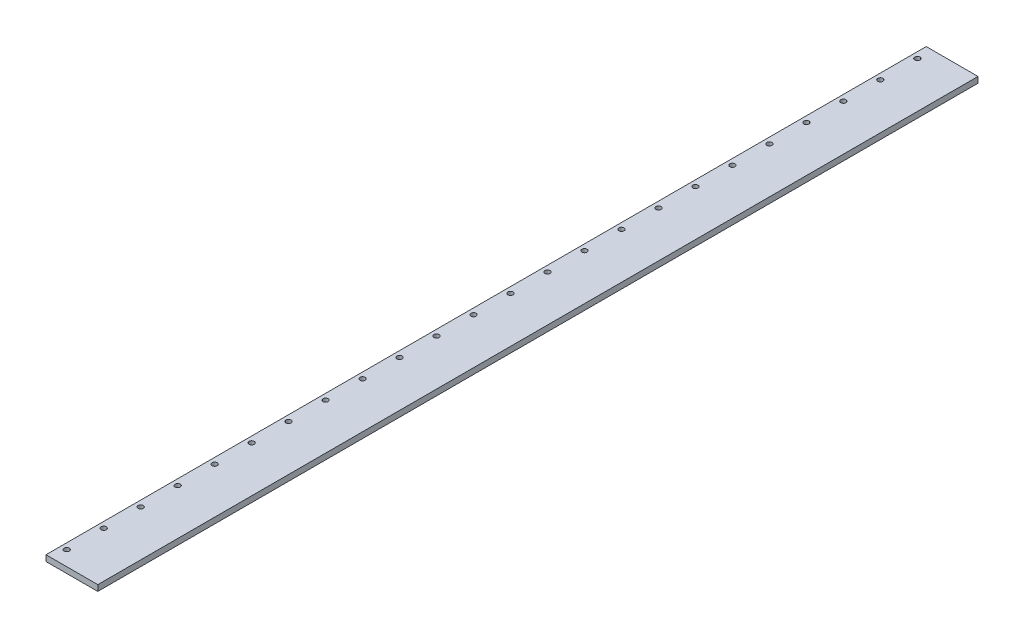
ISO-10303-21;
HEADER;
FILE_DESCRIPTION(('STEP AP214'),'2;1');
FILE_NAME('part.step','',(''),(''),'','','');
FILE_SCHEMA(('AUTOMOTIVE_DESIGN { 1 0 10303 214 1 1 1 1 }'));
ENDSEC;
DATA;
#1=APPLICATION_CONTEXT('core data for automotive mechanical design processes');
#2=APPLICATION_PROTOCOL_DEFINITION('international standard','automotive_design',2000,#1);
#3=PRODUCT_CONTEXT('',#1,'mechanical');
#4=PRODUCT('Part','Part','',(#3));
#5=PRODUCT_RELATED_PRODUCT_CATEGORY('part','',(#4));
#6=PRODUCT_DEFINITION_FORMATION('','',#4);
#7=PRODUCT_DEFINITION_CONTEXT('part definition',#1,'design');
#8=PRODUCT_DEFINITION('design','',#6,#7);
#9=PRODUCT_DEFINITION_SHAPE('','',#8);
#10=(LENGTH_UNIT() NAMED_UNIT(*) SI_UNIT(.MILLI.,.METRE.));
#11=(NAMED_UNIT(*) PLANE_ANGLE_UNIT() SI_UNIT($,.RADIAN.));
#12=(NAMED_UNIT(*) SI_UNIT($,.STERADIAN.) SOLID_ANGLE_UNIT());
#13=UNCERTAINTY_MEASURE_WITH_UNIT(LENGTH_MEASURE(1.E-05),#10,'distance_accuracy_value','');
#14=(GEOMETRIC_REPRESENTATION_CONTEXT(3) GLOBAL_UNCERTAINTY_ASSIGNED_CONTEXT((#13)) GLOBAL_UNIT_ASSIGNED_CONTEXT((#10,
#11,#12)) REPRESENTATION_CONTEXT('',''));
#15=CARTESIAN_POINT('',(0.,0.,0.));
#16=DIRECTION('',(0.,0.,1.));
#17=DIRECTION('',(1.,0.,0.));
#18=AXIS2_PLACEMENT_3D('',#15,#16,#17);
#19=CARTESIAN_POINT('',(-13.5,-2.,585.));
#20=DIRECTION('',(0.,1.,0.));
#21=DIRECTION('',(-1.,0.,0.));
#22=AXIS2_PLACEMENT_3D('',#19,#20,#21);
#23=CYLINDRICAL_SURFACE('',#22,1.75);
#24=CARTESIAN_POINT('',(-13.5,-2.,585.));
#25=DIRECTION('',(0.,1.,0.));
#26=DIRECTION('',(-1.,0.,0.));
#27=AXIS2_PLACEMENT_3D('',#24,#25,#26);
#28=CIRCLE('',#27,1.75);
#29=CARTESIAN_POINT('',(-15.25,-2.,585.));
#30=VERTEX_POINT('',#29);
#31=EDGE_CURVE('E46',#30,#30,#28,.T.);
#32=ORIENTED_EDGE('',*,*,#31,.F.);
#33=EDGE_LOOP('',(#32));
#34=FACE_BOUND('',#33,.T.);
#35=CARTESIAN_POINT('',(-13.5,2.,585.));
#36=DIRECTION('',(0.,1.,0.));
#37=DIRECTION('',(-1.,0.,0.));
#38=AXIS2_PLACEMENT_3D('',#35,#36,#37);
#39=CIRCLE('',#38,1.75);
#40=CARTESIAN_POINT('',(-15.25,2.,585.));
#41=VERTEX_POINT('',#40);
#42=EDGE_CURVE('E11',#41,#41,#39,.T.);
#43=ORIENTED_EDGE('',*,*,#42,.T.);
#44=EDGE_LOOP('',(#43));
#45=FACE_BOUND('',#44,.T.);
#46=ADVANCED_FACE('F37',(#34,#45),#23,.F.);
#47=CARTESIAN_POINT('',(-13.5,-2.,560.));
#48=DIRECTION('',(0.,1.,0.));
#49=DIRECTION('',(-1.,0.,0.));
#50=AXIS2_PLACEMENT_3D('',#47,#48,#49);
#51=CYLINDRICAL_SURFACE('',#50,1.75);
#52=CARTESIAN_POINT('',(-13.5,-2.,560.));
#53=DIRECTION('',(0.,1.,0.));
#54=DIRECTION('',(-1.,0.,0.));
#55=AXIS2_PLACEMENT_3D('',#52,#53,#54);
#56=CIRCLE('',#55,1.75);
#57=CARTESIAN_POINT('',(-15.25,-2.,560.));
#58=VERTEX_POINT('',#57);
#59=EDGE_CURVE('E287',#58,#58,#56,.T.);
#60=ORIENTED_EDGE('',*,*,#59,.F.);
#61=EDGE_LOOP('',(#60));
#62=FACE_BOUND('',#61,.T.);
#63=CARTESIAN_POINT('',(-13.5,2.,560.));
#64=DIRECTION('',(0.,1.,0.));
#65=DIRECTION('',(-1.,0.,0.));
#66=AXIS2_PLACEMENT_3D('',#63,#64,#65);
#67=CIRCLE('',#66,1.75);
#68=CARTESIAN_POINT('',(-15.25,2.,560.));
#69=VERTEX_POINT('',#68);
#70=EDGE_CURVE('E291',#69,#69,#67,.T.);
#71=ORIENTED_EDGE('',*,*,#70,.T.);
#72=EDGE_LOOP('',(#71));
#73=FACE_BOUND('',#72,.T.);
#74=ADVANCED_FACE('F302',(#62,#73),#51,.F.);
#75=CARTESIAN_POINT('',(-13.5,-2.,535.));
#76=DIRECTION('',(0.,1.,0.));
#77=DIRECTION('',(-1.,0.,0.));
#78=AXIS2_PLACEMENT_3D('',#75,#76,#77);
#79=CYLINDRICAL_SURFACE('',#78,1.75);
#80=CARTESIAN_POINT('',(-13.5,-2.,535.));
#81=DIRECTION('',(0.,1.,0.));
#82=DIRECTION('',(-1.,0.,0.));
#83=AXIS2_PLACEMENT_3D('',#80,#81,#82);
#84=CIRCLE('',#83,1.75);
#85=CARTESIAN_POINT('',(-15.25,-2.,535.));
#86=VERTEX_POINT('',#85);
#87=EDGE_CURVE('E279',#86,#86,#84,.T.);
#88=ORIENTED_EDGE('',*,*,#87,.F.);
#89=EDGE_LOOP('',(#88));
#90=FACE_BOUND('',#89,.T.);
#91=CARTESIAN_POINT('',(-13.5,2.,535.));
#92=DIRECTION('',(0.,1.,0.));
#93=DIRECTION('',(-1.,0.,0.));
#94=AXIS2_PLACEMENT_3D('',#91,#92,#93);
#95=CIRCLE('',#94,1.75);
#96=CARTESIAN_POINT('',(-15.25,2.,535.));
#97=VERTEX_POINT('',#96);
#98=EDGE_CURVE('E283',#97,#97,#95,.T.);
#99=ORIENTED_EDGE('',*,*,#98,.T.);
#100=EDGE_LOOP('',(#99));
#101=FACE_BOUND('',#100,.T.);
#102=ADVANCED_FACE('F395',(#90,#101),#79,.F.);
#103=CARTESIAN_POINT('',(-13.5,-2.,510.));
#104=DIRECTION('',(0.,1.,0.));
#105=DIRECTION('',(-1.,0.,0.));
#106=AXIS2_PLACEMENT_3D('',#103,#104,#105);
#107=CYLINDRICAL_SURFACE('',#106,1.75);
#108=CARTESIAN_POINT('',(-13.5,-2.,510.));
#109=DIRECTION('',(0.,1.,0.));
#110=DIRECTION('',(-1.,0.,0.));
#111=AXIS2_PLACEMENT_3D('',#108,#109,#110);
#112=CIRCLE('',#111,1.75);
#113=CARTESIAN_POINT('',(-15.25,-2.,510.));
#114=VERTEX_POINT('',#113);
#115=EDGE_CURVE('E271',#114,#114,#112,.T.);
#116=ORIENTED_EDGE('',*,*,#115,.F.);
#117=EDGE_LOOP('',(#116));
#118=FACE_BOUND('',#117,.T.);
#119=CARTESIAN_POINT('',(-13.5,2.,510.));
#120=DIRECTION('',(0.,1.,0.));
#121=DIRECTION('',(-1.,0.,0.));
#122=AXIS2_PLACEMENT_3D('',#119,#120,#121);
#123=CIRCLE('',#122,1.75);
#124=CARTESIAN_POINT('',(-15.25,2.,510.));
#125=VERTEX_POINT('',#124);
#126=EDGE_CURVE('E275',#125,#125,#123,.T.);
#127=ORIENTED_EDGE('',*,*,#126,.T.);
#128=EDGE_LOOP('',(#127));
#129=FACE_BOUND('',#128,.T.);
#130=ADVANCED_FACE('F391',(#118,#129),#107,.F.);
#131=CARTESIAN_POINT('',(-13.5,-2.,485.));
#132=DIRECTION('',(0.,1.,0.));
#133=DIRECTION('',(-1.,0.,0.));
#134=AXIS2_PLACEMENT_3D('',#131,#132,#133);
#135=CYLINDRICAL_SURFACE('',#134,1.75);
#136=CARTESIAN_POINT('',(-13.5,-2.,485.));
#137=DIRECTION('',(0.,1.,0.));
#138=DIRECTION('',(-1.,0.,0.));
#139=AXIS2_PLACEMENT_3D('',#136,#137,#138);
#140=CIRCLE('',#139,1.75);
#141=CARTESIAN_POINT('',(-15.25,-2.,485.));
#142=VERTEX_POINT('',#141);
#143=EDGE_CURVE('E263',#142,#142,#140,.T.);
#144=ORIENTED_EDGE('',*,*,#143,.F.);
#145=EDGE_LOOP('',(#144));
#146=FACE_BOUND('',#145,.T.);
#147=CARTESIAN_POINT('',(-13.5,2.,485.));
#148=DIRECTION('',(0.,1.,0.));
#149=DIRECTION('',(-1.,0.,0.));
#150=AXIS2_PLACEMENT_3D('',#147,#148,#149);
#151=CIRCLE('',#150,1.75);
#152=CARTESIAN_POINT('',(-15.25,2.,485.));
#153=VERTEX_POINT('',#152);
#154=EDGE_CURVE('E267',#153,#153,#151,.T.);
#155=ORIENTED_EDGE('',*,*,#154,.T.);
#156=EDGE_LOOP('',(#155));
#157=FACE_BOUND('',#156,.T.);
#158=ADVANCED_FACE('F387',(#146,#157),#135,.F.);
#159=CARTESIAN_POINT('',(-13.5,-2.,460.));
#160=DIRECTION('',(0.,1.,0.));
#161=DIRECTION('',(-1.,0.,0.));
#162=AXIS2_PLACEMENT_3D('',#159,#160,#161);
#163=CYLINDRICAL_SURFACE('',#162,1.75);
#164=CARTESIAN_POINT('',(-13.5,-2.,460.));
#165=DIRECTION('',(0.,1.,0.));
#166=DIRECTION('',(-1.,0.,0.));
#167=AXIS2_PLACEMENT_3D('',#164,#165,#166);
#168=CIRCLE('',#167,1.75);
#169=CARTESIAN_POINT('',(-15.25,-2.,460.));
#170=VERTEX_POINT('',#169);
#171=EDGE_CURVE('E255',#170,#170,#168,.T.);
#172=ORIENTED_EDGE('',*,*,#171,.F.);
#173=EDGE_LOOP('',(#172));
#174=FACE_BOUND('',#173,.T.);
#175=CARTESIAN_POINT('',(-13.5,2.,460.));
#176=DIRECTION('',(0.,1.,0.));
#177=DIRECTION('',(-1.,0.,0.));
#178=AXIS2_PLACEMENT_3D('',#175,#176,#177);
#179=CIRCLE('',#178,1.75);
#180=CARTESIAN_POINT('',(-15.25,2.,460.));
#181=VERTEX_POINT('',#180);
#182=EDGE_CURVE('E259',#181,#181,#179,.T.);
#183=ORIENTED_EDGE('',*,*,#182,.T.);
#184=EDGE_LOOP('',(#183));
#185=FACE_BOUND('',#184,.T.);
#186=ADVANCED_FACE('F383',(#174,#185),#163,.F.);
#187=CARTESIAN_POINT('',(-13.5,-2.,435.));
#188=DIRECTION('',(0.,1.,0.));
#189=DIRECTION('',(-1.,0.,0.));
#190=AXIS2_PLACEMENT_3D('',#187,#188,#189);
#191=CYLINDRICAL_SURFACE('',#190,1.75);
#192=CARTESIAN_POINT('',(-13.5,-2.,435.));
#193=DIRECTION('',(0.,1.,0.));
#194=DIRECTION('',(-1.,0.,0.));
#195=AXIS2_PLACEMENT_3D('',#192,#193,#194);
#196=CIRCLE('',#195,1.75);
#197=CARTESIAN_POINT('',(-15.25,-2.,435.));
#198=VERTEX_POINT('',#197);
#199=EDGE_CURVE('E247',#198,#198,#196,.T.);
#200=ORIENTED_EDGE('',*,*,#199,.F.);
#201=EDGE_LOOP('',(#200));
#202=FACE_BOUND('',#201,.T.);
#203=CARTESIAN_POINT('',(-13.5,2.,435.));
#204=DIRECTION('',(0.,1.,0.));
#205=DIRECTION('',(-1.,0.,0.));
#206=AXIS2_PLACEMENT_3D('',#203,#204,#205);
#207=CIRCLE('',#206,1.75);
#208=CARTESIAN_POINT('',(-15.25,2.,435.));
#209=VERTEX_POINT('',#208);
#210=EDGE_CURVE('E251',#209,#209,#207,.T.);
#211=ORIENTED_EDGE('',*,*,#210,.T.);
#212=EDGE_LOOP('',(#211));
#213=FACE_BOUND('',#212,.T.);
#214=ADVANCED_FACE('F379',(#202,#213),#191,.F.);
#215=CARTESIAN_POINT('',(-13.5,-2.,410.));
#216=DIRECTION('',(0.,1.,0.));
#217=DIRECTION('',(-1.,0.,0.));
#218=AXIS2_PLACEMENT_3D('',#215,#216,#217);
#219=CYLINDRICAL_SURFACE('',#218,1.75);
#220=CARTESIAN_POINT('',(-13.5,-2.,410.));
#221=DIRECTION('',(0.,1.,0.));
#222=DIRECTION('',(-1.,0.,0.));
#223=AXIS2_PLACEMENT_3D('',#220,#221,#222);
#224=CIRCLE('',#223,1.75);
#225=CARTESIAN_POINT('',(-15.25,-2.,410.));
#226=VERTEX_POINT('',#225);
#227=EDGE_CURVE('E239',#226,#226,#224,.T.);
#228=ORIENTED_EDGE('',*,*,#227,.F.);
#229=EDGE_LOOP('',(#228));
#230=FACE_BOUND('',#229,.T.);
#231=CARTESIAN_POINT('',(-13.5,2.,410.));
#232=DIRECTION('',(0.,1.,0.));
#233=DIRECTION('',(-1.,0.,0.));
#234=AXIS2_PLACEMENT_3D('',#231,#232,#233);
#235=CIRCLE('',#234,1.75);
#236=CARTESIAN_POINT('',(-15.25,2.,410.));
#237=VERTEX_POINT('',#236);
#238=EDGE_CURVE('E243',#237,#237,#235,.T.);
#239=ORIENTED_EDGE('',*,*,#238,.T.);
#240=EDGE_LOOP('',(#239));
#241=FACE_BOUND('',#240,.T.);
#242=ADVANCED_FACE('F375',(#230,#241),#219,.F.);
#243=CARTESIAN_POINT('',(-13.5,-2.,385.));
#244=DIRECTION('',(0.,1.,0.));
#245=DIRECTION('',(-1.,0.,0.));
#246=AXIS2_PLACEMENT_3D('',#243,#244,#245);
#247=CYLINDRICAL_SURFACE('',#246,1.75);
#248=CARTESIAN_POINT('',(-13.5,-2.,385.));
#249=DIRECTION('',(0.,1.,0.));
#250=DIRECTION('',(-1.,0.,0.));
#251=AXIS2_PLACEMENT_3D('',#248,#249,#250);
#252=CIRCLE('',#251,1.75);
#253=CARTESIAN_POINT('',(-15.25,-2.,385.));
#254=VERTEX_POINT('',#253);
#255=EDGE_CURVE('E231',#254,#254,#252,.T.);
#256=ORIENTED_EDGE('',*,*,#255,.F.);
#257=EDGE_LOOP('',(#256));
#258=FACE_BOUND('',#257,.T.);
#259=CARTESIAN_POINT('',(-13.5,2.,385.));
#260=DIRECTION('',(0.,1.,0.));
#261=DIRECTION('',(-1.,0.,0.));
#262=AXIS2_PLACEMENT_3D('',#259,#260,#261);
#263=CIRCLE('',#262,1.75);
#264=CARTESIAN_POINT('',(-15.25,2.,385.));
#265=VERTEX_POINT('',#264);
#266=EDGE_CURVE('E235',#265,#265,#263,.T.);
#267=ORIENTED_EDGE('',*,*,#266,.T.);
#268=EDGE_LOOP('',(#267));
#269=FACE_BOUND('',#268,.T.);
#270=ADVANCED_FACE('F371',(#258,#269),#247,.F.);
#271=CARTESIAN_POINT('',(-13.5,-2.,360.));
#272=DIRECTION('',(0.,1.,0.));
#273=DIRECTION('',(-1.,0.,0.));
#274=AXIS2_PLACEMENT_3D('',#271,#272,#273);
#275=CYLINDRICAL_SURFACE('',#274,1.75);
#276=CARTESIAN_POINT('',(-13.5,-2.,360.));
#277=DIRECTION('',(0.,1.,0.));
#278=DIRECTION('',(-1.,0.,0.));
#279=AXIS2_PLACEMENT_3D('',#276,#277,#278);
#280=CIRCLE('',#279,1.75);
#281=CARTESIAN_POINT('',(-15.25,-2.,360.));
#282=VERTEX_POINT('',#281);
#283=EDGE_CURVE('E223',#282,#282,#280,.T.);
#284=ORIENTED_EDGE('',*,*,#283,.F.);
#285=EDGE_LOOP('',(#284));
#286=FACE_BOUND('',#285,.T.);
#287=CARTESIAN_POINT('',(-13.5,2.,360.));
#288=DIRECTION('',(0.,1.,0.));
#289=DIRECTION('',(-1.,0.,0.));
#290=AXIS2_PLACEMENT_3D('',#287,#288,#289);
#291=CIRCLE('',#290,1.75);
#292=CARTESIAN_POINT('',(-15.25,2.,360.));
#293=VERTEX_POINT('',#292);
#294=EDGE_CURVE('E227',#293,#293,#291,.T.);
#295=ORIENTED_EDGE('',*,*,#294,.T.);
#296=EDGE_LOOP('',(#295));
#297=FACE_BOUND('',#296,.T.);
#298=ADVANCED_FACE('F367',(#286,#297),#275,.F.);
#299=CARTESIAN_POINT('',(-13.5,-2.,335.));
#300=DIRECTION('',(0.,1.,0.));
#301=DIRECTION('',(-1.,0.,0.));
#302=AXIS2_PLACEMENT_3D('',#299,#300,#301);
#303=CYLINDRICAL_SURFACE('',#302,1.75);
#304=CARTESIAN_POINT('',(-13.5,-2.,335.));
#305=DIRECTION('',(0.,1.,0.));
#306=DIRECTION('',(-1.,0.,0.));
#307=AXIS2_PLACEMENT_3D('',#304,#305,#306);
#308=CIRCLE('',#307,1.75);
#309=CARTESIAN_POINT('',(-15.25,-2.,335.));
#310=VERTEX_POINT('',#309);
#311=EDGE_CURVE('E215',#310,#310,#308,.T.);
#312=ORIENTED_EDGE('',*,*,#311,.F.);
#313=EDGE_LOOP('',(#312));
#314=FACE_BOUND('',#313,.T.);
#315=CARTESIAN_POINT('',(-13.5,2.,335.));
#316=DIRECTION('',(0.,1.,0.));
#317=DIRECTION('',(-1.,0.,0.));
#318=AXIS2_PLACEMENT_3D('',#315,#316,#317);
#319=CIRCLE('',#318,1.75);
#320=CARTESIAN_POINT('',(-15.25,2.,335.));
#321=VERTEX_POINT('',#320);
#322=EDGE_CURVE('E219',#321,#321,#319,.T.);
#323=ORIENTED_EDGE('',*,*,#322,.T.);
#324=EDGE_LOOP('',(#323));
#325=FACE_BOUND('',#324,.T.);
#326=ADVANCED_FACE('F363',(#314,#325),#303,.F.);
#327=CARTESIAN_POINT('',(-13.5,-2.,310.));
#328=DIRECTION('',(0.,1.,0.));
#329=DIRECTION('',(-1.,0.,0.));
#330=AXIS2_PLACEMENT_3D('',#327,#328,#329);
#331=CYLINDRICAL_SURFACE('',#330,1.75);
#332=CARTESIAN_POINT('',(-13.5,-2.,310.));
#333=DIRECTION('',(0.,1.,0.));
#334=DIRECTION('',(-1.,0.,0.));
#335=AXIS2_PLACEMENT_3D('',#332,#333,#334);
#336=CIRCLE('',#335,1.75);
#337=CARTESIAN_POINT('',(-15.25,-2.,310.));
#338=VERTEX_POINT('',#337);
#339=EDGE_CURVE('E207',#338,#338,#336,.T.);
#340=ORIENTED_EDGE('',*,*,#339,.F.);
#341=EDGE_LOOP('',(#340));
#342=FACE_BOUND('',#341,.T.);
#343=CARTESIAN_POINT('',(-13.5,2.,310.));
#344=DIRECTION('',(0.,1.,0.));
#345=DIRECTION('',(-1.,0.,0.));
#346=AXIS2_PLACEMENT_3D('',#343,#344,#345);
#347=CIRCLE('',#346,1.75);
#348=CARTESIAN_POINT('',(-15.25,2.,310.));
#349=VERTEX_POINT('',#348);
#350=EDGE_CURVE('E211',#349,#349,#347,.T.);
#351=ORIENTED_EDGE('',*,*,#350,.T.);
#352=EDGE_LOOP('',(#351));
#353=FACE_BOUND('',#352,.T.);
#354=ADVANCED_FACE('F359',(#342,#353),#331,.F.);
#355=CARTESIAN_POINT('',(-13.5,-2.,285.));
#356=DIRECTION('',(0.,1.,0.));
#357=DIRECTION('',(-1.,0.,0.));
#358=AXIS2_PLACEMENT_3D('',#355,#356,#357);
#359=CYLINDRICAL_SURFACE('',#358,1.75);
#360=CARTESIAN_POINT('',(-13.5,-2.,285.));
#361=DIRECTION('',(0.,1.,0.));
#362=DIRECTION('',(-1.,0.,0.));
#363=AXIS2_PLACEMENT_3D('',#360,#361,#362);
#364=CIRCLE('',#363,1.75);
#365=CARTESIAN_POINT('',(-15.25,-2.,285.));
#366=VERTEX_POINT('',#365);
#367=EDGE_CURVE('E199',#366,#366,#364,.T.);
#368=ORIENTED_EDGE('',*,*,#367,.F.);
#369=EDGE_LOOP('',(#368));
#370=FACE_BOUND('',#369,.T.);
#371=CARTESIAN_POINT('',(-13.5,2.,285.));
#372=DIRECTION('',(0.,1.,0.));
#373=DIRECTION('',(-1.,0.,0.));
#374=AXIS2_PLACEMENT_3D('',#371,#372,#373);
#375=CIRCLE('',#374,1.75);
#376=CARTESIAN_POINT('',(-15.25,2.,285.));
#377=VERTEX_POINT('',#376);
#378=EDGE_CURVE('E203',#377,#377,#375,.T.);
#379=ORIENTED_EDGE('',*,*,#378,.T.);
#380=EDGE_LOOP('',(#379));
#381=FACE_BOUND('',#380,.T.);
#382=ADVANCED_FACE('F355',(#370,#381),#359,.F.);
#383=CARTESIAN_POINT('',(-13.5,-2.,260.));
#384=DIRECTION('',(0.,1.,0.));
#385=DIRECTION('',(-1.,0.,0.));
#386=AXIS2_PLACEMENT_3D('',#383,#384,#385);
#387=CYLINDRICAL_SURFACE('',#386,1.75);
#388=CARTESIAN_POINT('',(-13.5,-2.,260.));
#389=DIRECTION('',(0.,1.,0.));
#390=DIRECTION('',(-1.,0.,0.));
#391=AXIS2_PLACEMENT_3D('',#388,#389,#390);
#392=CIRCLE('',#391,1.75);
#393=CARTESIAN_POINT('',(-15.25,-2.,260.));
#394=VERTEX_POINT('',#393);
#395=EDGE_CURVE('E191',#394,#394,#392,.T.);
#396=ORIENTED_EDGE('',*,*,#395,.F.);
#397=EDGE_LOOP('',(#396));
#398=FACE_BOUND('',#397,.T.);
#399=CARTESIAN_POINT('',(-13.5,2.,260.));
#400=DIRECTION('',(0.,1.,0.));
#401=DIRECTION('',(-1.,0.,0.));
#402=AXIS2_PLACEMENT_3D('',#399,#400,#401);
#403=CIRCLE('',#402,1.75);
#404=CARTESIAN_POINT('',(-15.25,2.,260.));
#405=VERTEX_POINT('',#404);
#406=EDGE_CURVE('E195',#405,#405,#403,.T.);
#407=ORIENTED_EDGE('',*,*,#406,.T.);
#408=EDGE_LOOP('',(#407));
#409=FACE_BOUND('',#408,.T.);
#410=ADVANCED_FACE('F351',(#398,#409),#387,.F.);
#411=CARTESIAN_POINT('',(-13.5,-2.,235.));
#412=DIRECTION('',(0.,1.,0.));
#413=DIRECTION('',(-1.,0.,0.));
#414=AXIS2_PLACEMENT_3D('',#411,#412,#413);
#415=CYLINDRICAL_SURFACE('',#414,1.75);
#416=CARTESIAN_POINT('',(-13.5,-2.,235.));
#417=DIRECTION('',(0.,1.,0.));
#418=DIRECTION('',(-1.,0.,0.));
#419=AXIS2_PLACEMENT_3D('',#416,#417,#418);
#420=CIRCLE('',#419,1.75);
#421=CARTESIAN_POINT('',(-15.25,-2.,235.));
#422=VERTEX_POINT('',#421);
#423=EDGE_CURVE('E183',#422,#422,#420,.T.);
#424=ORIENTED_EDGE('',*,*,#423,.F.);
#425=EDGE_LOOP('',(#424));
#426=FACE_BOUND('',#425,.T.);
#427=CARTESIAN_POINT('',(-13.5,2.,235.));
#428=DIRECTION('',(0.,1.,0.));
#429=DIRECTION('',(-1.,0.,0.));
#430=AXIS2_PLACEMENT_3D('',#427,#428,#429);
#431=CIRCLE('',#430,1.75);
#432=CARTESIAN_POINT('',(-15.25,2.,235.));
#433=VERTEX_POINT('',#432);
#434=EDGE_CURVE('E187',#433,#433,#431,.T.);
#435=ORIENTED_EDGE('',*,*,#434,.T.);
#436=EDGE_LOOP('',(#435));
#437=FACE_BOUND('',#436,.T.);
#438=ADVANCED_FACE('F347',(#426,#437),#415,.F.);
#439=CARTESIAN_POINT('',(-13.5,-2.,210.));
#440=DIRECTION('',(0.,1.,0.));
#441=DIRECTION('',(-1.,0.,0.));
#442=AXIS2_PLACEMENT_3D('',#439,#440,#441);
#443=CYLINDRICAL_SURFACE('',#442,1.75);
#444=CARTESIAN_POINT('',(-13.5,-2.,210.));
#445=DIRECTION('',(0.,1.,0.));
#446=DIRECTION('',(-1.,0.,0.));
#447=AXIS2_PLACEMENT_3D('',#444,#445,#446);
#448=CIRCLE('',#447,1.75);
#449=CARTESIAN_POINT('',(-15.25,-2.,210.));
#450=VERTEX_POINT('',#449);
#451=EDGE_CURVE('E175',#450,#450,#448,.T.);
#452=ORIENTED_EDGE('',*,*,#451,.F.);
#453=EDGE_LOOP('',(#452));
#454=FACE_BOUND('',#453,.T.);
#455=CARTESIAN_POINT('',(-13.5,2.,210.));
#456=DIRECTION('',(0.,1.,0.));
#457=DIRECTION('',(-1.,0.,0.));
#458=AXIS2_PLACEMENT_3D('',#455,#456,#457);
#459=CIRCLE('',#458,1.75);
#460=CARTESIAN_POINT('',(-15.25,2.,210.));
#461=VERTEX_POINT('',#460);
#462=EDGE_CURVE('E179',#461,#461,#459,.T.);
#463=ORIENTED_EDGE('',*,*,#462,.T.);
#464=EDGE_LOOP('',(#463));
#465=FACE_BOUND('',#464,.T.);
#466=ADVANCED_FACE('F343',(#454,#465),#443,.F.);
#467=CARTESIAN_POINT('',(-13.5,-2.,185.));
#468=DIRECTION('',(0.,1.,0.));
#469=DIRECTION('',(-1.,0.,0.));
#470=AXIS2_PLACEMENT_3D('',#467,#468,#469);
#471=CYLINDRICAL_SURFACE('',#470,1.75);
#472=CARTESIAN_POINT('',(-13.5,-2.,185.));
#473=DIRECTION('',(0.,1.,0.));
#474=DIRECTION('',(-1.,0.,0.));
#475=AXIS2_PLACEMENT_3D('',#472,#473,#474);
#476=CIRCLE('',#475,1.75);
#477=CARTESIAN_POINT('',(-15.25,-2.,185.));
#478=VERTEX_POINT('',#477);
#479=EDGE_CURVE('E167',#478,#478,#476,.T.);
#480=ORIENTED_EDGE('',*,*,#479,.F.);
#481=EDGE_LOOP('',(#480));
#482=FACE_BOUND('',#481,.T.);
#483=CARTESIAN_POINT('',(-13.5,2.,185.));
#484=DIRECTION('',(0.,1.,0.));
#485=DIRECTION('',(-1.,0.,0.));
#486=AXIS2_PLACEMENT_3D('',#483,#484,#485);
#487=CIRCLE('',#486,1.75);
#488=CARTESIAN_POINT('',(-15.25,2.,185.));
#489=VERTEX_POINT('',#488);
#490=EDGE_CURVE('E171',#489,#489,#487,.T.);
#491=ORIENTED_EDGE('',*,*,#490,.T.);
#492=EDGE_LOOP('',(#491));
#493=FACE_BOUND('',#492,.T.);
#494=ADVANCED_FACE('F339',(#482,#493),#471,.F.);
#495=CARTESIAN_POINT('',(-13.5,-2.,160.));
#496=DIRECTION('',(0.,1.,0.));
#497=DIRECTION('',(-1.,0.,0.));
#498=AXIS2_PLACEMENT_3D('',#495,#496,#497);
#499=CYLINDRICAL_SURFACE('',#498,1.75);
#500=CARTESIAN_POINT('',(-13.5,-2.,160.));
#501=DIRECTION('',(0.,1.,0.));
#502=DIRECTION('',(-1.,0.,0.));
#503=AXIS2_PLACEMENT_3D('',#500,#501,#502);
#504=CIRCLE('',#503,1.75);
#505=CARTESIAN_POINT('',(-15.25,-2.,160.));
#506=VERTEX_POINT('',#505);
#507=EDGE_CURVE('E159',#506,#506,#504,.T.);
#508=ORIENTED_EDGE('',*,*,#507,.F.);
#509=EDGE_LOOP('',(#508));
#510=FACE_BOUND('',#509,.T.);
#511=CARTESIAN_POINT('',(-13.5,2.,160.));
#512=DIRECTION('',(0.,1.,0.));
#513=DIRECTION('',(-1.,0.,0.));
#514=AXIS2_PLACEMENT_3D('',#511,#512,#513);
#515=CIRCLE('',#514,1.75);
#516=CARTESIAN_POINT('',(-15.25,2.,160.));
#517=VERTEX_POINT('',#516);
#518=EDGE_CURVE('E163',#517,#517,#515,.T.);
#519=ORIENTED_EDGE('',*,*,#518,.T.);
#520=EDGE_LOOP('',(#519));
#521=FACE_BOUND('',#520,.T.);
#522=ADVANCED_FACE('F335',(#510,#521),#499,.F.);
#523=CARTESIAN_POINT('',(-13.5,-2.,135.));
#524=DIRECTION('',(0.,1.,0.));
#525=DIRECTION('',(-1.,0.,0.));
#526=AXIS2_PLACEMENT_3D('',#523,#524,#525);
#527=CYLINDRICAL_SURFACE('',#526,1.75);
#528=CARTESIAN_POINT('',(-13.5,-2.,135.));
#529=DIRECTION('',(0.,1.,0.));
#530=DIRECTION('',(-1.,0.,0.));
#531=AXIS2_PLACEMENT_3D('',#528,#529,#530);
#532=CIRCLE('',#531,1.75);
#533=CARTESIAN_POINT('',(-15.25,-2.,135.));
#534=VERTEX_POINT('',#533);
#535=EDGE_CURVE('E151',#534,#534,#532,.T.);
#536=ORIENTED_EDGE('',*,*,#535,.F.);
#537=EDGE_LOOP('',(#536));
#538=FACE_BOUND('',#537,.T.);
#539=CARTESIAN_POINT('',(-13.5,2.,135.));
#540=DIRECTION('',(0.,1.,0.));
#541=DIRECTION('',(-1.,0.,0.));
#542=AXIS2_PLACEMENT_3D('',#539,#540,#541);
#543=CIRCLE('',#542,1.75);
#544=CARTESIAN_POINT('',(-15.25,2.,135.));
#545=VERTEX_POINT('',#544);
#546=EDGE_CURVE('E155',#545,#545,#543,.T.);
#547=ORIENTED_EDGE('',*,*,#546,.T.);
#548=EDGE_LOOP('',(#547));
#549=FACE_BOUND('',#548,.T.);
#550=ADVANCED_FACE('F331',(#538,#549),#527,.F.);
#551=CARTESIAN_POINT('',(-13.5,-2.,110.));
#552=DIRECTION('',(0.,1.,0.));
#553=DIRECTION('',(-1.,0.,0.));
#554=AXIS2_PLACEMENT_3D('',#551,#552,#553);
#555=CYLINDRICAL_SURFACE('',#554,1.75);
#556=CARTESIAN_POINT('',(-13.5,-2.,110.));
#557=DIRECTION('',(0.,1.,0.));
#558=DIRECTION('',(-1.,0.,0.));
#559=AXIS2_PLACEMENT_3D('',#556,#557,#558);
#560=CIRCLE('',#559,1.75);
#561=CARTESIAN_POINT('',(-15.25,-2.,110.));
#562=VERTEX_POINT('',#561);
#563=EDGE_CURVE('E143',#562,#562,#560,.T.);
#564=ORIENTED_EDGE('',*,*,#563,.F.);
#565=EDGE_LOOP('',(#564));
#566=FACE_BOUND('',#565,.T.);
#567=CARTESIAN_POINT('',(-13.5,2.,110.));
#568=DIRECTION('',(0.,1.,0.));
#569=DIRECTION('',(-1.,0.,0.));
#570=AXIS2_PLACEMENT_3D('',#567,#568,#569);
#571=CIRCLE('',#570,1.75);
#572=CARTESIAN_POINT('',(-15.25,2.,110.));
#573=VERTEX_POINT('',#572);
#574=EDGE_CURVE('E147',#573,#573,#571,.T.);
#575=ORIENTED_EDGE('',*,*,#574,.T.);
#576=EDGE_LOOP('',(#575));
#577=FACE_BOUND('',#576,.T.);
#578=ADVANCED_FACE('F327',(#566,#577),#555,.F.);
#579=CARTESIAN_POINT('',(-13.5,-2.,85.));
#580=DIRECTION('',(0.,1.,0.));
#581=DIRECTION('',(-1.,0.,0.));
#582=AXIS2_PLACEMENT_3D('',#579,#580,#581);
#583=CYLINDRICAL_SURFACE('',#582,1.75);
#584=CARTESIAN_POINT('',(-13.5,-2.,85.));
#585=DIRECTION('',(0.,1.,0.));
#586=DIRECTION('',(-1.,0.,0.));
#587=AXIS2_PLACEMENT_3D('',#584,#585,#586);
#588=CIRCLE('',#587,1.75);
#589=CARTESIAN_POINT('',(-15.25,-2.,85.));
#590=VERTEX_POINT('',#589);
#591=EDGE_CURVE('E135',#590,#590,#588,.T.);
#592=ORIENTED_EDGE('',*,*,#591,.F.);
#593=EDGE_LOOP('',(#592));
#594=FACE_BOUND('',#593,.T.);
#595=CARTESIAN_POINT('',(-13.5,2.,85.));
#596=DIRECTION('',(0.,1.,0.));
#597=DIRECTION('',(-1.,0.,0.));
#598=AXIS2_PLACEMENT_3D('',#595,#596,#597);
#599=CIRCLE('',#598,1.75);
#600=CARTESIAN_POINT('',(-15.25,2.,85.));
#601=VERTEX_POINT('',#600);
#602=EDGE_CURVE('E139',#601,#601,#599,.T.);
#603=ORIENTED_EDGE('',*,*,#602,.T.);
#604=EDGE_LOOP('',(#603));
#605=FACE_BOUND('',#604,.T.);
#606=ADVANCED_FACE('F323',(#594,#605),#583,.F.);
#607=CARTESIAN_POINT('',(-13.5,-2.,60.));
#608=DIRECTION('',(0.,1.,0.));
#609=DIRECTION('',(-1.,0.,0.));
#610=AXIS2_PLACEMENT_3D('',#607,#608,#609);
#611=CYLINDRICAL_SURFACE('',#610,1.75);
#612=CARTESIAN_POINT('',(-13.5,-2.,60.));
#613=DIRECTION('',(0.,1.,0.));
#614=DIRECTION('',(-1.,0.,0.));
#615=AXIS2_PLACEMENT_3D('',#612,#613,#614);
#616=CIRCLE('',#615,1.75);
#617=CARTESIAN_POINT('',(-15.25,-2.,60.));
#618=VERTEX_POINT('',#617);
#619=EDGE_CURVE('E127',#618,#618,#616,.T.);
#620=ORIENTED_EDGE('',*,*,#619,.F.);
#621=EDGE_LOOP('',(#620));
#622=FACE_BOUND('',#621,.T.);
#623=CARTESIAN_POINT('',(-13.5,2.,60.));
#624=DIRECTION('',(0.,1.,0.));
#625=DIRECTION('',(-1.,0.,0.));
#626=AXIS2_PLACEMENT_3D('',#623,#624,#625);
#627=CIRCLE('',#626,1.75);
#628=CARTESIAN_POINT('',(-15.25,2.,60.));
#629=VERTEX_POINT('',#628);
#630=EDGE_CURVE('E131',#629,#629,#627,.T.);
#631=ORIENTED_EDGE('',*,*,#630,.T.);
#632=EDGE_LOOP('',(#631));
#633=FACE_BOUND('',#632,.T.);
#634=ADVANCED_FACE('F314',(#622,#633),#611,.F.);
#635=CARTESIAN_POINT('',(17.5,-2.,595.));
#636=DIRECTION('',(-1.,0.,0.));
#637=DIRECTION('',(0.,0.,1.));
#638=AXIS2_PLACEMENT_3D('',#635,#636,#637);
#639=PLANE('',#638);
#640=DIRECTION('',(0.,1.,0.));
#641=VECTOR('',#640,1.);
#642=CARTESIAN_POINT('',(17.5,-2.,0.));
#643=LINE('',#642,#641);
#644=CARTESIAN_POINT('',(17.5,-2.,0.));
#645=VERTEX_POINT('',#644);
#646=CARTESIAN_POINT('',(17.5,2.,0.));
#647=VERTEX_POINT('',#646);
#648=EDGE_CURVE('E110',#645,#647,#643,.T.);
#649=ORIENTED_EDGE('',*,*,#648,.T.);
#650=DIRECTION('',(0.,0.,-1.));
#651=VECTOR('',#650,1.);
#652=CARTESIAN_POINT('',(17.5,2.,595.));
#653=LINE('',#652,#651);
#654=CARTESIAN_POINT('',(17.5,2.,595.));
#655=VERTEX_POINT('',#654);
#656=EDGE_CURVE('E99',#655,#647,#653,.T.);
#657=ORIENTED_EDGE('',*,*,#656,.F.);
#658=DIRECTION('',(0.,1.,0.));
#659=VECTOR('',#658,1.);
#660=CARTESIAN_POINT('',(17.5,-2.,595.));
#661=LINE('',#660,#659);
#662=CARTESIAN_POINT('',(17.5,-2.,595.));
#663=VERTEX_POINT('',#662);
#664=EDGE_CURVE('E90',#663,#655,#661,.T.);
#665=ORIENTED_EDGE('',*,*,#664,.F.);
#666=DIRECTION('',(0.,0.,-1.));
#667=VECTOR('',#666,1.);
#668=CARTESIAN_POINT('',(17.5,-2.,595.));
#669=LINE('',#668,#667);
#670=EDGE_CURVE('E106',#663,#645,#669,.T.);
#671=ORIENTED_EDGE('',*,*,#670,.T.);
#672=EDGE_LOOP('',(#649,#657,#665,#671));
#673=FACE_BOUND('',#672,.T.);
#674=ADVANCED_FACE('F306',(#673),#639,.F.);
#675=CARTESIAN_POINT('',(17.5,2.,595.));
#676=DIRECTION('',(0.,-1.,0.));
#677=DIRECTION('',(1.,0.,0.));
#678=AXIS2_PLACEMENT_3D('',#675,#676,#677);
#679=PLANE('',#678);
#680=CARTESIAN_POINT('',(-13.5,2.,35.));
#681=DIRECTION('',(0.,1.,0.));
#682=DIRECTION('',(-1.,0.,0.));
#683=AXIS2_PLACEMENT_3D('',#680,#681,#682);
#684=CIRCLE('',#683,1.75);
#685=CARTESIAN_POINT('',(-15.25,2.,35.));
#686=VERTEX_POINT('',#685);
#687=EDGE_CURVE('E434',#686,#686,#684,.T.);
#688=ORIENTED_EDGE('',*,*,#687,.F.);
#689=EDGE_LOOP('',(#688));
#690=FACE_BOUND('',#689,.T.);
#691=CARTESIAN_POINT('',(-13.5,2.,10.));
#692=DIRECTION('',(0.,1.,0.));
#693=DIRECTION('',(-1.,0.,0.));
#694=AXIS2_PLACEMENT_3D('',#691,#692,#693);
#695=CIRCLE('',#694,1.75);
#696=CARTESIAN_POINT('',(-15.25,2.,10.));
#697=VERTEX_POINT('',#696);
#698=EDGE_CURVE('E436',#697,#697,#695,.T.);
#699=ORIENTED_EDGE('',*,*,#698,.F.);
#700=EDGE_LOOP('',(#699));
#701=FACE_BOUND('',#700,.T.);
#702=DIRECTION('',(-1.,0.,0.));
#703=VECTOR('',#702,1.);
#704=CARTESIAN_POINT('',(17.5,2.,0.));
#705=LINE('',#704,#703);
#706=CARTESIAN_POINT('',(-17.5,2.,0.));
#707=VERTEX_POINT('',#706);
#708=EDGE_CURVE('E97',#647,#707,#705,.T.);
#709=ORIENTED_EDGE('',*,*,#708,.T.);
#710=DIRECTION('',(0.,0.,-1.));
#711=VECTOR('',#710,1.);
#712=CARTESIAN_POINT('',(-17.5,2.,595.));
#713=LINE('',#712,#711);
#714=CARTESIAN_POINT('',(-17.5,2.,595.));
#715=VERTEX_POINT('',#714);
#716=EDGE_CURVE('E94',#715,#707,#713,.T.);
#717=ORIENTED_EDGE('',*,*,#716,.F.);
#718=DIRECTION('',(-1.,0.,0.));
#719=VECTOR('',#718,1.);
#720=CARTESIAN_POINT('',(17.5,2.,595.));
#721=LINE('',#720,#719);
#722=EDGE_CURVE('E85',#655,#715,#721,.T.);
#723=ORIENTED_EDGE('',*,*,#722,.F.);
#724=ORIENTED_EDGE('',*,*,#656,.T.);
#725=EDGE_LOOP('',(#709,#717,#723,#724));
#726=FACE_BOUND('',#725,.T.);
#727=ORIENTED_EDGE('',*,*,#630,.F.);
#728=EDGE_LOOP('',(#727));
#729=FACE_BOUND('',#728,.T.);
#730=ORIENTED_EDGE('',*,*,#602,.F.);
#731=EDGE_LOOP('',(#730));
#732=FACE_BOUND('',#731,.T.);
#733=ORIENTED_EDGE('',*,*,#574,.F.);
#734=EDGE_LOOP('',(#733));
#735=FACE_BOUND('',#734,.T.);
#736=ORIENTED_EDGE('',*,*,#546,.F.);
#737=EDGE_LOOP('',(#736));
#738=FACE_BOUND('',#737,.T.);
#739=ORIENTED_EDGE('',*,*,#518,.F.);
#740=EDGE_LOOP('',(#739));
#741=FACE_BOUND('',#740,.T.);
#742=ORIENTED_EDGE('',*,*,#490,.F.);
#743=EDGE_LOOP('',(#742));
#744=FACE_BOUND('',#743,.T.);
#745=ORIENTED_EDGE('',*,*,#462,.F.);
#746=EDGE_LOOP('',(#745));
#747=FACE_BOUND('',#746,.T.);
#748=ORIENTED_EDGE('',*,*,#434,.F.);
#749=EDGE_LOOP('',(#748));
#750=FACE_BOUND('',#749,.T.);
#751=ORIENTED_EDGE('',*,*,#406,.F.);
#752=EDGE_LOOP('',(#751));
#753=FACE_BOUND('',#752,.T.);
#754=ORIENTED_EDGE('',*,*,#378,.F.);
#755=EDGE_LOOP('',(#754));
#756=FACE_BOUND('',#755,.T.);
#757=ORIENTED_EDGE('',*,*,#350,.F.);
#758=EDGE_LOOP('',(#757));
#759=FACE_BOUND('',#758,.T.);
#760=ORIENTED_EDGE('',*,*,#322,.F.);
#761=EDGE_LOOP('',(#760));
#762=FACE_BOUND('',#761,.T.);
#763=ORIENTED_EDGE('',*,*,#294,.F.);
#764=EDGE_LOOP('',(#763));
#765=FACE_BOUND('',#764,.T.);
#766=ORIENTED_EDGE('',*,*,#266,.F.);
#767=EDGE_LOOP('',(#766));
#768=FACE_BOUND('',#767,.T.);
#769=ORIENTED_EDGE('',*,*,#238,.F.);
#770=EDGE_LOOP('',(#769));
#771=FACE_BOUND('',#770,.T.);
#772=ORIENTED_EDGE('',*,*,#210,.F.);
#773=EDGE_LOOP('',(#772));
#774=FACE_BOUND('',#773,.T.);
#775=ORIENTED_EDGE('',*,*,#182,.F.);
#776=EDGE_LOOP('',(#775));
#777=FACE_BOUND('',#776,.T.);
#778=ORIENTED_EDGE('',*,*,#154,.F.);
#779=EDGE_LOOP('',(#778));
#780=FACE_BOUND('',#779,.T.);
#781=ORIENTED_EDGE('',*,*,#126,.F.);
#782=EDGE_LOOP('',(#781));
#783=FACE_BOUND('',#782,.T.);
#784=ORIENTED_EDGE('',*,*,#98,.F.);
#785=EDGE_LOOP('',(#784));
#786=FACE_BOUND('',#785,.T.);
#787=ORIENTED_EDGE('',*,*,#70,.F.);
#788=EDGE_LOOP('',(#787));
#789=FACE_BOUND('',#788,.T.);
#790=ORIENTED_EDGE('',*,*,#42,.F.);
#791=EDGE_LOOP('',(#790));
#792=FACE_BOUND('',#791,.T.);
#793=ADVANCED_FACE('F95',(#690,#701,#726,#729,#732,#735,#738,#741,#744,#747,#750,#753,#756,#759,
#762,#765,#768,#771,#774,#777,#780,#783,#786,#789,#792),#679,.F.);
#794=CARTESIAN_POINT('',(-17.5,-2.,595.));
#795=DIRECTION('',(1.,0.,0.));
#796=DIRECTION('',(0.,0.,-1.));
#797=AXIS2_PLACEMENT_3D('',#794,#795,#796);
#798=PLANE('',#797);
#799=DIRECTION('',(0.,-1.,0.));
#800=VECTOR('',#799,1.);
#801=CARTESIAN_POINT('',(-17.5,-2.,0.));
#802=LINE('',#801,#800);
#803=CARTESIAN_POINT('',(-17.5,-2.,0.));
#804=VERTEX_POINT('',#803);
#805=EDGE_CURVE('E71',#707,#804,#802,.T.);
#806=ORIENTED_EDGE('',*,*,#805,.T.);
#807=DIRECTION('',(0.,0.,-1.));
#808=VECTOR('',#807,1.);
#809=CARTESIAN_POINT('',(-17.5,-2.,595.));
#810=LINE('',#809,#808);
#811=CARTESIAN_POINT('',(-17.5,-2.,595.));
#812=VERTEX_POINT('',#811);
#813=EDGE_CURVE('E100',#812,#804,#810,.T.);
#814=ORIENTED_EDGE('',*,*,#813,.F.);
#815=DIRECTION('',(0.,-1.,0.));
#816=VECTOR('',#815,1.);
#817=CARTESIAN_POINT('',(-17.5,-2.,595.));
#818=LINE('',#817,#816);
#819=EDGE_CURVE('E88',#715,#812,#818,.T.);
#820=ORIENTED_EDGE('',*,*,#819,.F.);
#821=ORIENTED_EDGE('',*,*,#716,.T.);
#822=EDGE_LOOP('',(#806,#814,#820,#821));
#823=FACE_BOUND('',#822,.T.);
#824=ADVANCED_FACE('F102',(#823),#798,.F.);
#825=CARTESIAN_POINT('',(-17.5,-2.,595.));
#826=DIRECTION('',(0.,1.,0.));
#827=DIRECTION('',(0.,0.,1.));
#828=AXIS2_PLACEMENT_3D('',#825,#826,#827);
#829=PLANE('',#828);
#830=CARTESIAN_POINT('',(-13.5,-2.,35.));
#831=DIRECTION('',(0.,1.,0.));
#832=DIRECTION('',(-1.,0.,0.));
#833=AXIS2_PLACEMENT_3D('',#830,#831,#832);
#834=CIRCLE('',#833,1.75);
#835=CARTESIAN_POINT('',(-15.25,-2.,35.));
#836=VERTEX_POINT('',#835);
#837=EDGE_CURVE('E432',#836,#836,#834,.T.);
#838=ORIENTED_EDGE('',*,*,#837,.T.);
#839=EDGE_LOOP('',(#838));
#840=FACE_BOUND('',#839,.T.);
#841=CARTESIAN_POINT('',(-13.5,-2.,10.));
#842=DIRECTION('',(0.,1.,0.));
#843=DIRECTION('',(-1.,0.,0.));
#844=AXIS2_PLACEMENT_3D('',#841,#842,#843);
#845=CIRCLE('',#844,1.75);
#846=CARTESIAN_POINT('',(-15.25,-2.,10.));
#847=VERTEX_POINT('',#846);
#848=EDGE_CURVE('E114',#847,#847,#845,.T.);
#849=ORIENTED_EDGE('',*,*,#848,.T.);
#850=EDGE_LOOP('',(#849));
#851=FACE_BOUND('',#850,.T.);
#852=DIRECTION('',(1.,0.,0.));
#853=VECTOR('',#852,1.);
#854=CARTESIAN_POINT('',(-17.5,-2.,0.));
#855=LINE('',#854,#853);
#856=EDGE_CURVE('E77',#804,#645,#855,.T.);
#857=ORIENTED_EDGE('',*,*,#856,.T.);
#858=ORIENTED_EDGE('',*,*,#670,.F.);
#859=DIRECTION('',(1.,0.,0.));
#860=VECTOR('',#859,1.);
#861=CARTESIAN_POINT('',(-17.5,-2.,595.));
#862=LINE('',#861,#860);
#863=EDGE_CURVE('E54',#812,#663,#862,.T.);
#864=ORIENTED_EDGE('',*,*,#863,.F.);
#865=ORIENTED_EDGE('',*,*,#813,.T.);
#866=EDGE_LOOP('',(#857,#858,#864,#865));
#867=FACE_BOUND('',#866,.T.);
#868=ORIENTED_EDGE('',*,*,#619,.T.);
#869=EDGE_LOOP('',(#868));
#870=FACE_BOUND('',#869,.T.);
#871=ORIENTED_EDGE('',*,*,#591,.T.);
#872=EDGE_LOOP('',(#871));
#873=FACE_BOUND('',#872,.T.);
#874=ORIENTED_EDGE('',*,*,#563,.T.);
#875=EDGE_LOOP('',(#874));
#876=FACE_BOUND('',#875,.T.);
#877=ORIENTED_EDGE('',*,*,#535,.T.);
#878=EDGE_LOOP('',(#877));
#879=FACE_BOUND('',#878,.T.);
#880=ORIENTED_EDGE('',*,*,#507,.T.);
#881=EDGE_LOOP('',(#880));
#882=FACE_BOUND('',#881,.T.);
#883=ORIENTED_EDGE('',*,*,#479,.T.);
#884=EDGE_LOOP('',(#883));
#885=FACE_BOUND('',#884,.T.);
#886=ORIENTED_EDGE('',*,*,#451,.T.);
#887=EDGE_LOOP('',(#886));
#888=FACE_BOUND('',#887,.T.);
#889=ORIENTED_EDGE('',*,*,#423,.T.);
#890=EDGE_LOOP('',(#889));
#891=FACE_BOUND('',#890,.T.);
#892=ORIENTED_EDGE('',*,*,#395,.T.);
#893=EDGE_LOOP('',(#892));
#894=FACE_BOUND('',#893,.T.);
#895=ORIENTED_EDGE('',*,*,#367,.T.);
#896=EDGE_LOOP('',(#895));
#897=FACE_BOUND('',#896,.T.);
#898=ORIENTED_EDGE('',*,*,#339,.T.);
#899=EDGE_LOOP('',(#898));
#900=FACE_BOUND('',#899,.T.);
#901=ORIENTED_EDGE('',*,*,#311,.T.);
#902=EDGE_LOOP('',(#901));
#903=FACE_BOUND('',#902,.T.);
#904=ORIENTED_EDGE('',*,*,#283,.T.);
#905=EDGE_LOOP('',(#904));
#906=FACE_BOUND('',#905,.T.);
#907=ORIENTED_EDGE('',*,*,#255,.T.);
#908=EDGE_LOOP('',(#907));
#909=FACE_BOUND('',#908,.T.);
#910=ORIENTED_EDGE('',*,*,#227,.T.);
#911=EDGE_LOOP('',(#910));
#912=FACE_BOUND('',#911,.T.);
#913=ORIENTED_EDGE('',*,*,#199,.T.);
#914=EDGE_LOOP('',(#913));
#915=FACE_BOUND('',#914,.T.);
#916=ORIENTED_EDGE('',*,*,#171,.T.);
#917=EDGE_LOOP('',(#916));
#918=FACE_BOUND('',#917,.T.);
#919=ORIENTED_EDGE('',*,*,#143,.T.);
#920=EDGE_LOOP('',(#919));
#921=FACE_BOUND('',#920,.T.);
#922=ORIENTED_EDGE('',*,*,#115,.T.);
#923=EDGE_LOOP('',(#922));
#924=FACE_BOUND('',#923,.T.);
#925=ORIENTED_EDGE('',*,*,#87,.T.);
#926=EDGE_LOOP('',(#925));
#927=FACE_BOUND('',#926,.T.);
#928=ORIENTED_EDGE('',*,*,#59,.T.);
#929=EDGE_LOOP('',(#928));
#930=FACE_BOUND('',#929,.T.);
#931=ORIENTED_EDGE('',*,*,#31,.T.);
#932=EDGE_LOOP('',(#931));
#933=FACE_BOUND('',#932,.T.);
#934=ADVANCED_FACE('F298',(#840,#851,#867,#870,#873,#876,#879,#882,#885,#888,#891,#894,#897,
#900,#903,#906,#909,#912,#915,#918,#921,#924,#927,#930,#933),#829,.F.);
#935=CARTESIAN_POINT('',(0.,0.,595.));
#936=DIRECTION('',(0.,0.,1.));
#937=DIRECTION('',(1.,0.,0.));
#938=AXIS2_PLACEMENT_3D('',#935,#936,#937);
#939=PLANE('',#938);
#940=ORIENTED_EDGE('',*,*,#664,.T.);
#941=ORIENTED_EDGE('',*,*,#722,.T.);
#942=ORIENTED_EDGE('',*,*,#819,.T.);
#943=ORIENTED_EDGE('',*,*,#863,.T.);
#944=EDGE_LOOP('',(#940,#941,#942,#943));
#945=FACE_BOUND('',#944,.T.);
#946=ADVANCED_FACE('F86',(#945),#939,.T.);
#947=CARTESIAN_POINT('',(0.,0.,0.));
#948=DIRECTION('',(0.,0.,1.));
#949=DIRECTION('',(1.,0.,0.));
#950=AXIS2_PLACEMENT_3D('',#947,#948,#949);
#951=PLANE('',#950);
#952=ORIENTED_EDGE('',*,*,#648,.F.);
#953=ORIENTED_EDGE('',*,*,#856,.F.);
#954=ORIENTED_EDGE('',*,*,#805,.F.);
#955=ORIENTED_EDGE('',*,*,#708,.F.);
#956=EDGE_LOOP('',(#952,#953,#954,#955));
#957=FACE_BOUND('',#956,.T.);
#958=ADVANCED_FACE('F413',(#957),#951,.F.);
#959=CARTESIAN_POINT('',(-13.5,-2.,10.));
#960=DIRECTION('',(0.,1.,0.));
#961=DIRECTION('',(-1.,0.,0.));
#962=AXIS2_PLACEMENT_3D('',#959,#960,#961);
#963=CYLINDRICAL_SURFACE('',#962,1.75);
#964=ORIENTED_EDGE('',*,*,#848,.F.);
#965=EDGE_LOOP('',(#964));
#966=FACE_BOUND('',#965,.T.);
#967=ORIENTED_EDGE('',*,*,#698,.T.);
#968=EDGE_LOOP('',(#967));
#969=FACE_BOUND('',#968,.T.);
#970=ADVANCED_FACE('F419',(#966,#969),#963,.F.);
#971=CARTESIAN_POINT('',(-13.5,-2.,35.));
#972=DIRECTION('',(0.,1.,0.));
#973=DIRECTION('',(-1.,0.,0.));
#974=AXIS2_PLACEMENT_3D('',#971,#972,#973);
#975=CYLINDRICAL_SURFACE('',#974,1.75);
#976=ORIENTED_EDGE('',*,*,#837,.F.);
#977=EDGE_LOOP('',(#976));
#978=FACE_BOUND('',#977,.T.);
#979=ORIENTED_EDGE('',*,*,#687,.T.);
#980=EDGE_LOOP('',(#979));
#981=FACE_BOUND('',#980,.T.);
#982=ADVANCED_FACE('F424',(#978,#981),#975,.F.);
#983=CLOSED_SHELL('',(#46,#74,#102,#130,#158,#186,#214,#242,#270,#298,#326,#354,#382,#410,#438,
#466,#494,#522,#550,#578,#606,#634,#674,#793,#824,#934,#946,#958,#970,#982));
#984=MANIFOLD_SOLID_BREP('B2',#983);
#985=ADVANCED_BREP_SHAPE_REPRESENTATION('',(#18,#984),#14);
#986=SHAPE_DEFINITION_REPRESENTATION(#9,#985);
ENDSEC;
END-ISO-10303-21;
